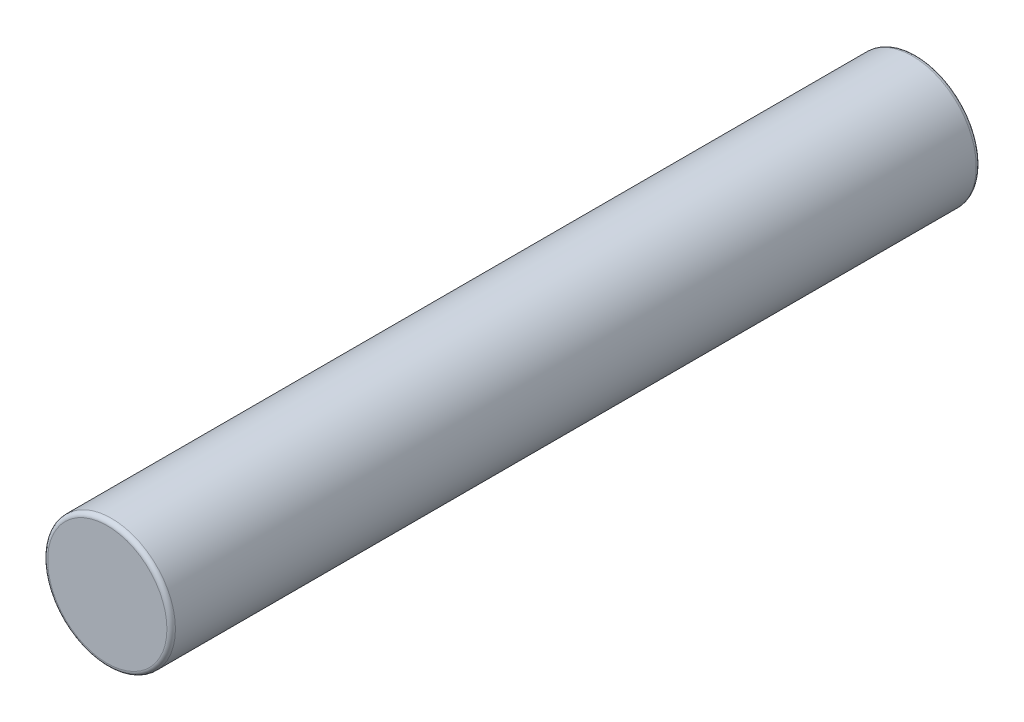
ISO-10303-21;
HEADER;
FILE_DESCRIPTION(('STEP AP214'),'2;1');
FILE_NAME('part.step','',(''),(''),'','','');
FILE_SCHEMA(('AUTOMOTIVE_DESIGN { 1 0 10303 214 1 1 1 1 }'));
ENDSEC;
DATA;
#1=APPLICATION_CONTEXT('core data for automotive mechanical design processes');
#2=APPLICATION_PROTOCOL_DEFINITION('international standard','automotive_design',2000,#1);
#3=PRODUCT_CONTEXT('',#1,'mechanical');
#4=PRODUCT('Part','Part','',(#3));
#5=PRODUCT_RELATED_PRODUCT_CATEGORY('part','',(#4));
#6=PRODUCT_DEFINITION_FORMATION('','',#4);
#7=PRODUCT_DEFINITION_CONTEXT('part definition',#1,'design');
#8=PRODUCT_DEFINITION('design','',#6,#7);
#9=PRODUCT_DEFINITION_SHAPE('','',#8);
#10=(LENGTH_UNIT() NAMED_UNIT(*) SI_UNIT(.MILLI.,.METRE.));
#11=(NAMED_UNIT(*) PLANE_ANGLE_UNIT() SI_UNIT($,.RADIAN.));
#12=(NAMED_UNIT(*) SI_UNIT($,.STERADIAN.) SOLID_ANGLE_UNIT());
#13=UNCERTAINTY_MEASURE_WITH_UNIT(LENGTH_MEASURE(1.E-05),#10,'distance_accuracy_value','');
#14=(GEOMETRIC_REPRESENTATION_CONTEXT(3) GLOBAL_UNCERTAINTY_ASSIGNED_CONTEXT((#13)) GLOBAL_UNIT_ASSIGNED_CONTEXT((#10,
#11,#12)) REPRESENTATION_CONTEXT('',''));
#15=CARTESIAN_POINT('',(0.,0.,0.));
#16=DIRECTION('',(0.,0.,1.));
#17=DIRECTION('',(1.,0.,0.));
#18=AXIS2_PLACEMENT_3D('',#15,#16,#17);
#19=CARTESIAN_POINT('',(0.,0.,-4.75));
#20=DIRECTION('',(0.,0.,1.));
#21=DIRECTION('',(1.,0.,0.));
#22=AXIS2_PLACEMENT_3D('',#19,#20,#21);
#23=CYLINDRICAL_SURFACE('',#22,0.75);
#24=CARTESIAN_POINT('',(0.,0.,-4.7));
#25=DIRECTION('',(0.,0.,1.));
#26=DIRECTION('',(1.,0.,0.));
#27=AXIS2_PLACEMENT_3D('',#24,#25,#26);
#28=CIRCLE('',#27,0.75);
#29=CARTESIAN_POINT('',(0.75,0.,-4.7));
#30=VERTEX_POINT('',#29);
#31=EDGE_CURVE('E42',#30,#30,#28,.T.);
#32=ORIENTED_EDGE('',*,*,#31,.T.);
#33=EDGE_LOOP('',(#32));
#34=FACE_BOUND('',#33,.T.);
#35=CARTESIAN_POINT('',(0.,0.,4.7));
#36=DIRECTION('',(0.,0.,1.));
#37=DIRECTION('',(1.,0.,0.));
#38=AXIS2_PLACEMENT_3D('',#35,#36,#37);
#39=CIRCLE('',#38,0.75);
#40=CARTESIAN_POINT('',(0.75,0.,4.7));
#41=VERTEX_POINT('',#40);
#42=EDGE_CURVE('E46',#41,#41,#39,.F.);
#43=ORIENTED_EDGE('',*,*,#42,.T.);
#44=EDGE_LOOP('',(#43));
#45=FACE_BOUND('',#44,.T.);
#46=ADVANCED_FACE('F31',(#34,#45),#23,.T.);
#47=CARTESIAN_POINT('',(0.,0.,-4.75));
#48=DIRECTION('',(0.,0.,1.));
#49=DIRECTION('',(1.,0.,0.));
#50=AXIS2_PLACEMENT_3D('',#47,#48,#49);
#51=PLANE('',#50);
#52=CARTESIAN_POINT('',(0.,0.,-4.75));
#53=DIRECTION('',(0.,0.,1.));
#54=DIRECTION('',(1.,0.,0.));
#55=AXIS2_PLACEMENT_3D('',#52,#53,#54);
#56=CIRCLE('',#55,0.7);
#57=CARTESIAN_POINT('',(0.7,0.,-4.75));
#58=VERTEX_POINT('',#57);
#59=EDGE_CURVE('E38',#58,#58,#56,.F.);
#60=ORIENTED_EDGE('',*,*,#59,.T.);
#61=EDGE_LOOP('',(#60));
#62=FACE_BOUND('',#61,.T.);
#63=ADVANCED_FACE('F62',(#62),#51,.F.);
#64=CARTESIAN_POINT('',(0.,0.,4.75));
#65=DIRECTION('',(0.,0.,1.));
#66=DIRECTION('',(1.,0.,0.));
#67=AXIS2_PLACEMENT_3D('',#64,#65,#66);
#68=PLANE('',#67);
#69=CARTESIAN_POINT('',(0.,0.,4.75));
#70=DIRECTION('',(0.,0.,1.));
#71=DIRECTION('',(1.,0.,0.));
#72=AXIS2_PLACEMENT_3D('',#69,#70,#71);
#73=CIRCLE('',#72,0.7);
#74=CARTESIAN_POINT('',(0.7,0.,4.75));
#75=VERTEX_POINT('',#74);
#76=EDGE_CURVE('E10',#75,#75,#73,.T.);
#77=ORIENTED_EDGE('',*,*,#76,.T.);
#78=EDGE_LOOP('',(#77));
#79=FACE_BOUND('',#78,.T.);
#80=ADVANCED_FACE('F59',(#79),#68,.T.);
#81=CARTESIAN_POINT('',(0.,0.,-4.7));
#82=DIRECTION('',(0.,0.,1.));
#83=DIRECTION('',(1.,0.,0.));
#84=AXIS2_PLACEMENT_3D('',#81,#82,#83);
#85=TOROIDAL_SURFACE('',#84,0.7,0.05);
#86=ORIENTED_EDGE('',*,*,#59,.F.);
#87=EDGE_LOOP('',(#86));
#88=FACE_BOUND('',#87,.T.);
#89=ORIENTED_EDGE('',*,*,#31,.F.);
#90=EDGE_LOOP('',(#89));
#91=FACE_BOUND('',#90,.T.);
#92=ADVANCED_FACE('F55',(#88,#91),#85,.T.);
#93=CARTESIAN_POINT('',(0.,0.,4.7));
#94=DIRECTION('',(0.,0.,1.));
#95=DIRECTION('',(1.,0.,0.));
#96=AXIS2_PLACEMENT_3D('',#93,#94,#95);
#97=TOROIDAL_SURFACE('',#96,0.7,0.05);
#98=ORIENTED_EDGE('',*,*,#42,.F.);
#99=EDGE_LOOP('',(#98));
#100=FACE_BOUND('',#99,.T.);
#101=ORIENTED_EDGE('',*,*,#76,.F.);
#102=EDGE_LOOP('',(#101));
#103=FACE_BOUND('',#102,.T.);
#104=ADVANCED_FACE('F33',(#100,#103),#97,.T.);
#105=CLOSED_SHELL('',(#46,#63,#80,#92,#104));
#106=MANIFOLD_SOLID_BREP('B2',#105);
#107=ADVANCED_BREP_SHAPE_REPRESENTATION('',(#18,#106),#14);
#108=SHAPE_DEFINITION_REPRESENTATION(#9,#107);
ENDSEC;
END-ISO-10303-21;
